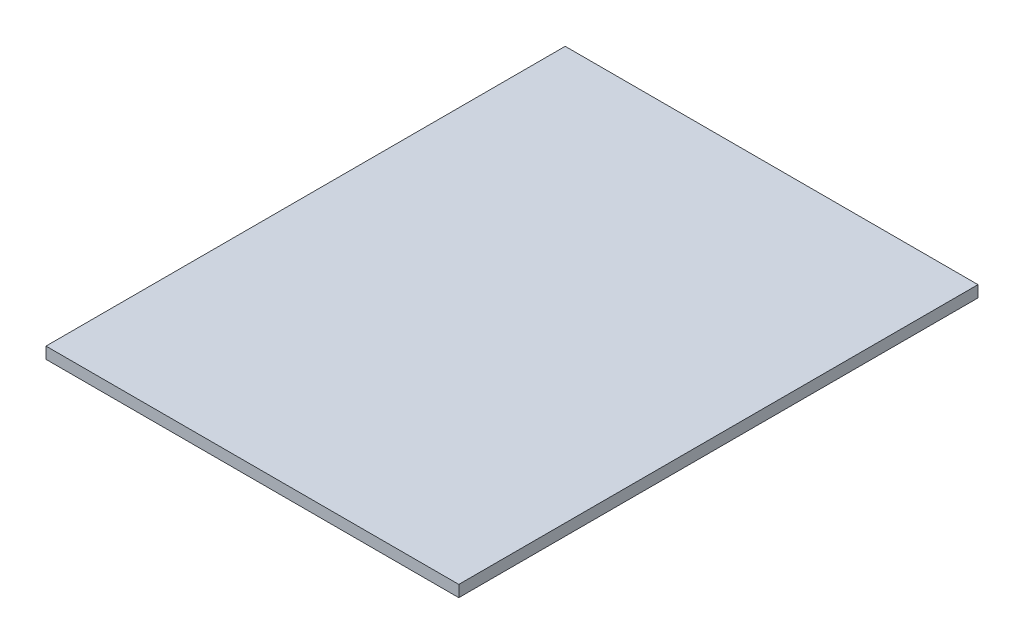
ISO-10303-21;
HEADER;
FILE_DESCRIPTION(('STEP AP214'),'2;1');
FILE_NAME('part.step','',(''),(''),'','','');
FILE_SCHEMA(('AUTOMOTIVE_DESIGN { 1 0 10303 214 1 1 1 1 }'));
ENDSEC;
DATA;
#1=APPLICATION_CONTEXT('core data for automotive mechanical design processes');
#2=APPLICATION_PROTOCOL_DEFINITION('international standard','automotive_design',2000,#1);
#3=PRODUCT_CONTEXT('',#1,'mechanical');
#4=PRODUCT('Part','Part','',(#3));
#5=PRODUCT_RELATED_PRODUCT_CATEGORY('part','',(#4));
#6=PRODUCT_DEFINITION_FORMATION('','',#4);
#7=PRODUCT_DEFINITION_CONTEXT('part definition',#1,'design');
#8=PRODUCT_DEFINITION('design','',#6,#7);
#9=PRODUCT_DEFINITION_SHAPE('','',#8);
#10=(LENGTH_UNIT() NAMED_UNIT(*) SI_UNIT(.MILLI.,.METRE.));
#11=(NAMED_UNIT(*) PLANE_ANGLE_UNIT() SI_UNIT($,.RADIAN.));
#12=(NAMED_UNIT(*) SI_UNIT($,.STERADIAN.) SOLID_ANGLE_UNIT());
#13=UNCERTAINTY_MEASURE_WITH_UNIT(LENGTH_MEASURE(1.E-05),#10,'distance_accuracy_value','');
#14=(GEOMETRIC_REPRESENTATION_CONTEXT(3) GLOBAL_UNCERTAINTY_ASSIGNED_CONTEXT((#13)) GLOBAL_UNIT_ASSIGNED_CONTEXT((#10,
#11,#12)) REPRESENTATION_CONTEXT('',''));
#15=CARTESIAN_POINT('',(0.,0.,0.));
#16=DIRECTION('',(0.,0.,1.));
#17=DIRECTION('',(1.,0.,0.));
#18=AXIS2_PLACEMENT_3D('',#15,#16,#17);
#19=CARTESIAN_POINT('',(-305.,17.,-55.73));
#20=DIRECTION('',(1.,0.,0.));
#21=DIRECTION('',(0.,0.,-1.));
#22=AXIS2_PLACEMENT_3D('',#19,#20,#21);
#23=PLANE('',#22);
#24=DIRECTION('',(0.,0.,1.));
#25=VECTOR('',#24,1.);
#26=CARTESIAN_POINT('',(-305.,0.,-55.73));
#27=LINE('',#26,#25);
#28=CARTESIAN_POINT('',(-305.,0.,-55.73));
#29=VERTEX_POINT('',#28);
#30=CARTESIAN_POINT('',(-305.,0.,710.27));
#31=VERTEX_POINT('',#30);
#32=EDGE_CURVE('E96',#29,#31,#27,.T.);
#33=ORIENTED_EDGE('',*,*,#32,.T.);
#34=DIRECTION('',(0.,-1.,0.));
#35=VECTOR('',#34,1.);
#36=CARTESIAN_POINT('',(-305.,17.,710.27));
#37=LINE('',#36,#35);
#38=CARTESIAN_POINT('',(-305.,17.,710.27));
#39=VERTEX_POINT('',#38);
#40=EDGE_CURVE('E11',#39,#31,#37,.T.);
#41=ORIENTED_EDGE('',*,*,#40,.F.);
#42=DIRECTION('',(0.,0.,1.));
#43=VECTOR('',#42,1.);
#44=CARTESIAN_POINT('',(-305.,17.,-55.73));
#45=LINE('',#44,#43);
#46=CARTESIAN_POINT('',(-305.,17.,-55.73));
#47=VERTEX_POINT('',#46);
#48=EDGE_CURVE('E84',#47,#39,#45,.T.);
#49=ORIENTED_EDGE('',*,*,#48,.F.);
#50=DIRECTION('',(0.,-1.,0.));
#51=VECTOR('',#50,1.);
#52=CARTESIAN_POINT('',(-305.,17.,-55.73));
#53=LINE('',#52,#51);
#54=EDGE_CURVE('E92',#47,#29,#53,.T.);
#55=ORIENTED_EDGE('',*,*,#54,.T.);
#56=EDGE_LOOP('',(#33,#41,#49,#55));
#57=FACE_BOUND('',#56,.T.);
#58=ADVANCED_FACE('F33',(#57),#23,.F.);
#59=CARTESIAN_POINT('',(-305.,17.,710.27));
#60=DIRECTION('',(0.,0.,-1.));
#61=DIRECTION('',(-1.,0.,0.));
#62=AXIS2_PLACEMENT_3D('',#59,#60,#61);
#63=PLANE('',#62);
#64=DIRECTION('',(1.,0.,0.));
#65=VECTOR('',#64,1.);
#66=CARTESIAN_POINT('',(-305.,0.,710.27));
#67=LINE('',#66,#65);
#68=CARTESIAN_POINT('',(304.,0.,710.27));
#69=VERTEX_POINT('',#68);
#70=EDGE_CURVE('E88',#31,#69,#67,.T.);
#71=ORIENTED_EDGE('',*,*,#70,.T.);
#72=DIRECTION('',(0.,-1.,0.));
#73=VECTOR('',#72,1.);
#74=CARTESIAN_POINT('',(304.,17.,710.27));
#75=LINE('',#74,#73);
#76=CARTESIAN_POINT('',(304.,17.,710.27));
#77=VERTEX_POINT('',#76);
#78=EDGE_CURVE('E41',#77,#69,#75,.T.);
#79=ORIENTED_EDGE('',*,*,#78,.F.);
#80=DIRECTION('',(1.,0.,0.));
#81=VECTOR('',#80,1.);
#82=CARTESIAN_POINT('',(-305.,17.,710.27));
#83=LINE('',#82,#81);
#84=EDGE_CURVE('E79',#39,#77,#83,.T.);
#85=ORIENTED_EDGE('',*,*,#84,.F.);
#86=ORIENTED_EDGE('',*,*,#40,.T.);
#87=EDGE_LOOP('',(#71,#79,#85,#86));
#88=FACE_BOUND('',#87,.T.);
#89=ADVANCED_FACE('F87',(#88),#63,.F.);
#90=CARTESIAN_POINT('',(304.,17.,-55.73));
#91=DIRECTION('',(-1.,0.,0.));
#92=DIRECTION('',(0.,0.,1.));
#93=AXIS2_PLACEMENT_3D('',#90,#91,#92);
#94=PLANE('',#93);
#95=DIRECTION('',(0.,0.,-1.));
#96=VECTOR('',#95,1.);
#97=CARTESIAN_POINT('',(304.,0.,-55.73));
#98=LINE('',#97,#96);
#99=CARTESIAN_POINT('',(304.,0.,-55.73));
#100=VERTEX_POINT('',#99);
#101=EDGE_CURVE('E66',#69,#100,#98,.T.);
#102=ORIENTED_EDGE('',*,*,#101,.T.);
#103=DIRECTION('',(0.,-1.,0.));
#104=VECTOR('',#103,1.);
#105=CARTESIAN_POINT('',(304.,17.,-55.73));
#106=LINE('',#105,#104);
#107=CARTESIAN_POINT('',(304.,17.,-55.73));
#108=VERTEX_POINT('',#107);
#109=EDGE_CURVE('E89',#108,#100,#106,.T.);
#110=ORIENTED_EDGE('',*,*,#109,.F.);
#111=DIRECTION('',(0.,0.,-1.));
#112=VECTOR('',#111,1.);
#113=CARTESIAN_POINT('',(304.,17.,-55.73));
#114=LINE('',#113,#112);
#115=EDGE_CURVE('E82',#77,#108,#114,.T.);
#116=ORIENTED_EDGE('',*,*,#115,.F.);
#117=ORIENTED_EDGE('',*,*,#78,.T.);
#118=EDGE_LOOP('',(#102,#110,#116,#117));
#119=FACE_BOUND('',#118,.T.);
#120=ADVANCED_FACE('F90',(#119),#94,.F.);
#121=CARTESIAN_POINT('',(-305.,17.,-55.73));
#122=DIRECTION('',(0.,0.,1.));
#123=DIRECTION('',(1.,0.,0.));
#124=AXIS2_PLACEMENT_3D('',#121,#122,#123);
#125=PLANE('',#124);
#126=DIRECTION('',(-1.,0.,0.));
#127=VECTOR('',#126,1.);
#128=CARTESIAN_POINT('',(-305.,0.,-55.73));
#129=LINE('',#128,#127);
#130=EDGE_CURVE('E72',#100,#29,#129,.T.);
#131=ORIENTED_EDGE('',*,*,#130,.T.);
#132=ORIENTED_EDGE('',*,*,#54,.F.);
#133=DIRECTION('',(-1.,0.,0.));
#134=VECTOR('',#133,1.);
#135=CARTESIAN_POINT('',(-305.,17.,-55.73));
#136=LINE('',#135,#134);
#137=EDGE_CURVE('E49',#108,#47,#136,.T.);
#138=ORIENTED_EDGE('',*,*,#137,.F.);
#139=ORIENTED_EDGE('',*,*,#109,.T.);
#140=EDGE_LOOP('',(#131,#132,#138,#139));
#141=FACE_BOUND('',#140,.T.);
#142=ADVANCED_FACE('F103',(#141),#125,.F.);
#143=CARTESIAN_POINT('',(-305.,17.,710.27));
#144=DIRECTION('',(0.,1.,0.));
#145=DIRECTION('',(0.,0.,1.));
#146=AXIS2_PLACEMENT_3D('',#143,#144,#145);
#147=PLANE('',#146);
#148=ORIENTED_EDGE('',*,*,#48,.T.);
#149=ORIENTED_EDGE('',*,*,#84,.T.);
#150=ORIENTED_EDGE('',*,*,#115,.T.);
#151=ORIENTED_EDGE('',*,*,#137,.T.);
#152=EDGE_LOOP('',(#148,#149,#150,#151));
#153=FACE_BOUND('',#152,.T.);
#154=ADVANCED_FACE('F80',(#153),#147,.T.);
#155=CARTESIAN_POINT('',(-305.,0.,710.27));
#156=DIRECTION('',(0.,1.,0.));
#157=DIRECTION('',(0.,0.,1.));
#158=AXIS2_PLACEMENT_3D('',#155,#156,#157);
#159=PLANE('',#158);
#160=ORIENTED_EDGE('',*,*,#32,.F.);
#161=ORIENTED_EDGE('',*,*,#130,.F.);
#162=ORIENTED_EDGE('',*,*,#101,.F.);
#163=ORIENTED_EDGE('',*,*,#70,.F.);
#164=EDGE_LOOP('',(#160,#161,#162,#163));
#165=FACE_BOUND('',#164,.T.);
#166=ADVANCED_FACE('F106',(#165),#159,.F.);
#167=CLOSED_SHELL('',(#58,#89,#120,#142,#154,#166));
#168=MANIFOLD_SOLID_BREP('B2',#167);
#169=ADVANCED_BREP_SHAPE_REPRESENTATION('',(#18,#168),#14);
#170=SHAPE_DEFINITION_REPRESENTATION(#9,#169);
ENDSEC;
END-ISO-10303-21;
